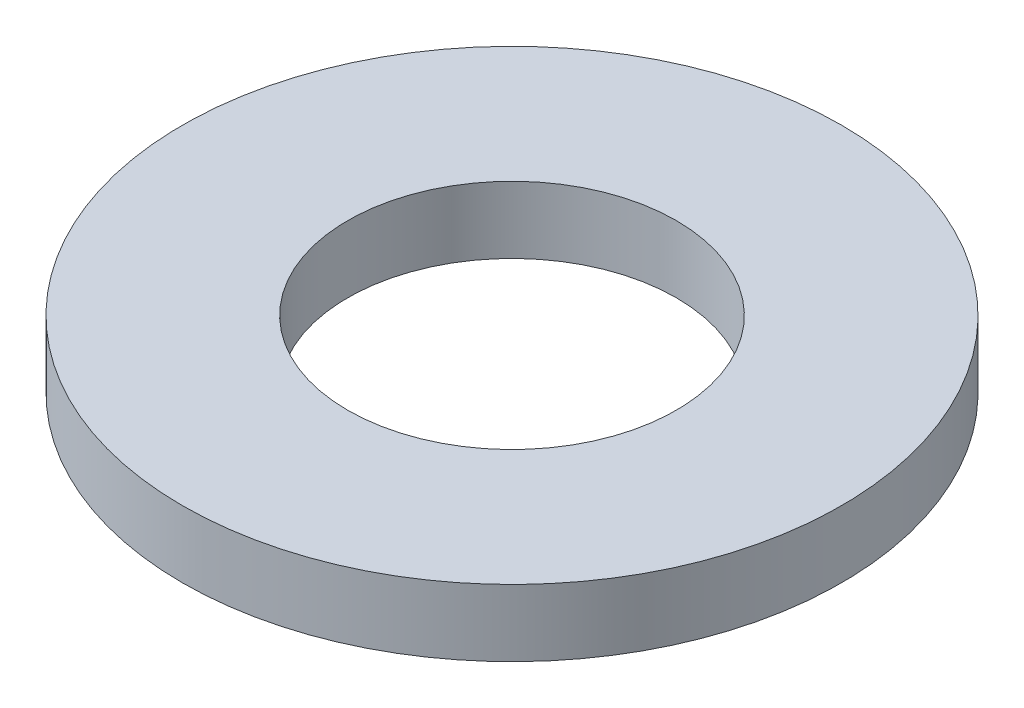
ISO-10303-21;
HEADER;
FILE_DESCRIPTION(('STEP AP214'),'2;1');
FILE_NAME('part.step','',(''),(''),'','','');
FILE_SCHEMA(('AUTOMOTIVE_DESIGN { 1 0 10303 214 1 1 1 1 }'));
ENDSEC;
DATA;
#1=APPLICATION_CONTEXT('core data for automotive mechanical design processes');
#2=APPLICATION_PROTOCOL_DEFINITION('international standard','automotive_design',2000,#1);
#3=PRODUCT_CONTEXT('',#1,'mechanical');
#4=PRODUCT('Part','Part','',(#3));
#5=PRODUCT_RELATED_PRODUCT_CATEGORY('part','',(#4));
#6=PRODUCT_DEFINITION_FORMATION('','',#4);
#7=PRODUCT_DEFINITION_CONTEXT('part definition',#1,'design');
#8=PRODUCT_DEFINITION('design','',#6,#7);
#9=PRODUCT_DEFINITION_SHAPE('','',#8);
#10=(LENGTH_UNIT() NAMED_UNIT(*) SI_UNIT(.MILLI.,.METRE.));
#11=(NAMED_UNIT(*) PLANE_ANGLE_UNIT() SI_UNIT($,.RADIAN.));
#12=(NAMED_UNIT(*) SI_UNIT($,.STERADIAN.) SOLID_ANGLE_UNIT());
#13=UNCERTAINTY_MEASURE_WITH_UNIT(LENGTH_MEASURE(1.E-05),#10,'distance_accuracy_value','');
#14=(GEOMETRIC_REPRESENTATION_CONTEXT(3) GLOBAL_UNCERTAINTY_ASSIGNED_CONTEXT((#13)) GLOBAL_UNIT_ASSIGNED_CONTEXT((#10,
#11,#12)) REPRESENTATION_CONTEXT('',''));
#15=CARTESIAN_POINT('',(0.,0.,0.));
#16=DIRECTION('',(0.,0.,1.));
#17=DIRECTION('',(1.,0.,0.));
#18=AXIS2_PLACEMENT_3D('',#15,#16,#17);
#19=CARTESIAN_POINT('',(0.,1.778,0.));
#20=DIRECTION('',(0.,1.,0.));
#21=DIRECTION('',(0.,0.,1.));
#22=AXIS2_PLACEMENT_3D('',#19,#20,#21);
#23=PLANE('',#22);
#24=CARTESIAN_POINT('',(0.,1.778,0.));
#25=DIRECTION('',(0.,1.,0.));
#26=DIRECTION('',(0.,0.,1.));
#27=AXIS2_PLACEMENT_3D('',#24,#25,#26);
#28=CIRCLE('',#27,8.76299999999999);
#29=CARTESIAN_POINT('',(0.,1.778,8.76299999999999));
#30=VERTEX_POINT('',#29);
#31=EDGE_CURVE('E10',#30,#30,#28,.T.);
#32=ORIENTED_EDGE('',*,*,#31,.T.);
#33=EDGE_LOOP('',(#32));
#34=FACE_BOUND('',#33,.T.);
#35=CARTESIAN_POINT('',(0.,1.778,0.));
#36=DIRECTION('',(0.,1.,0.));
#37=DIRECTION('',(0.,0.,1.));
#38=AXIS2_PLACEMENT_3D('',#35,#36,#37);
#39=CIRCLE('',#38,4.3688);
#40=CARTESIAN_POINT('',(0.,1.778,4.3688));
#41=VERTEX_POINT('',#40);
#42=EDGE_CURVE('E44',#41,#41,#39,.T.);
#43=ORIENTED_EDGE('',*,*,#42,.F.);
#44=EDGE_LOOP('',(#43));
#45=FACE_BOUND('',#44,.T.);
#46=ADVANCED_FACE('F33',(#34,#45),#23,.T.);
#47=CARTESIAN_POINT('',(0.,0.,0.));
#48=DIRECTION('',(0.,1.,0.));
#49=DIRECTION('',(0.,0.,1.));
#50=AXIS2_PLACEMENT_3D('',#47,#48,#49);
#51=PLANE('',#50);
#52=CARTESIAN_POINT('',(0.,0.,0.));
#53=DIRECTION('',(0.,1.,0.));
#54=DIRECTION('',(0.,0.,1.));
#55=AXIS2_PLACEMENT_3D('',#52,#53,#54);
#56=CIRCLE('',#55,8.76299999999999);
#57=CARTESIAN_POINT('',(0.,0.,8.76299999999999));
#58=VERTEX_POINT('',#57);
#59=EDGE_CURVE('E37',#58,#58,#56,.T.);
#60=ORIENTED_EDGE('',*,*,#59,.F.);
#61=EDGE_LOOP('',(#60));
#62=FACE_BOUND('',#61,.T.);
#63=CARTESIAN_POINT('',(0.,0.,0.));
#64=DIRECTION('',(0.,1.,0.));
#65=DIRECTION('',(0.,0.,1.));
#66=AXIS2_PLACEMENT_3D('',#63,#64,#65);
#67=CIRCLE('',#66,4.3688);
#68=CARTESIAN_POINT('',(0.,0.,4.3688));
#69=VERTEX_POINT('',#68);
#70=EDGE_CURVE('E46',#69,#69,#67,.T.);
#71=ORIENTED_EDGE('',*,*,#70,.T.);
#72=EDGE_LOOP('',(#71));
#73=FACE_BOUND('',#72,.T.);
#74=ADVANCED_FACE('F56',(#62,#73),#51,.F.);
#75=CARTESIAN_POINT('',(0.,1.778,0.));
#76=DIRECTION('',(0.,-1.,0.));
#77=DIRECTION('',(0.,0.,-1.));
#78=AXIS2_PLACEMENT_3D('',#75,#76,#77);
#79=CYLINDRICAL_SURFACE('',#78,8.76299999999999);
#80=ORIENTED_EDGE('',*,*,#31,.F.);
#81=EDGE_LOOP('',(#80));
#82=FACE_BOUND('',#81,.T.);
#83=ORIENTED_EDGE('',*,*,#59,.T.);
#84=EDGE_LOOP('',(#83));
#85=FACE_BOUND('',#84,.T.);
#86=ADVANCED_FACE('F35',(#82,#85),#79,.T.);
#87=CARTESIAN_POINT('',(0.,1.778,0.));
#88=DIRECTION('',(0.,-1.,0.));
#89=DIRECTION('',(0.,0.,-1.));
#90=AXIS2_PLACEMENT_3D('',#87,#88,#89);
#91=CYLINDRICAL_SURFACE('',#90,4.3688);
#92=ORIENTED_EDGE('',*,*,#42,.T.);
#93=EDGE_LOOP('',(#92));
#94=FACE_BOUND('',#93,.T.);
#95=ORIENTED_EDGE('',*,*,#70,.F.);
#96=EDGE_LOOP('',(#95));
#97=FACE_BOUND('',#96,.T.);
#98=ADVANCED_FACE('F52',(#94,#97),#91,.F.);
#99=CLOSED_SHELL('',(#46,#74,#86,#98));
#100=MANIFOLD_SOLID_BREP('B2',#99);
#101=ADVANCED_BREP_SHAPE_REPRESENTATION('',(#18,#100),#14);
#102=SHAPE_DEFINITION_REPRESENTATION(#9,#101);
ENDSEC;
END-ISO-10303-21;
